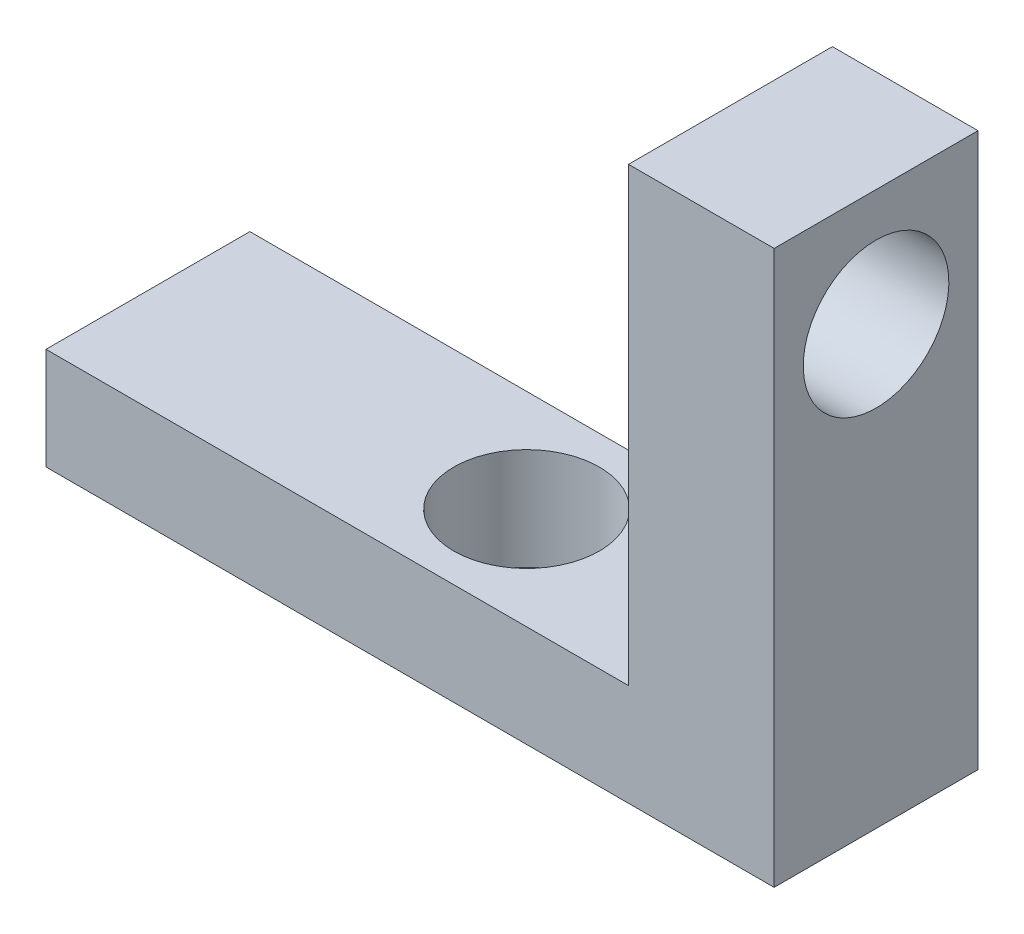
ISO-10303-21;
HEADER;
FILE_DESCRIPTION(('STEP AP214'),'2;1');
FILE_NAME('part.step','',(''),(''),'','','');
FILE_SCHEMA(('AUTOMOTIVE_DESIGN { 1 0 10303 214 1 1 1 1 }'));
ENDSEC;
DATA;
#1=APPLICATION_CONTEXT('core data for automotive mechanical design processes');
#2=APPLICATION_PROTOCOL_DEFINITION('international standard','automotive_design',2000,#1);
#3=PRODUCT_CONTEXT('',#1,'mechanical');
#4=PRODUCT('Part','Part','',(#3));
#5=PRODUCT_RELATED_PRODUCT_CATEGORY('part','',(#4));
#6=PRODUCT_DEFINITION_FORMATION('','',#4);
#7=PRODUCT_DEFINITION_CONTEXT('part definition',#1,'design');
#8=PRODUCT_DEFINITION('design','',#6,#7);
#9=PRODUCT_DEFINITION_SHAPE('','',#8);
#10=(LENGTH_UNIT() NAMED_UNIT(*) SI_UNIT(.MILLI.,.METRE.));
#11=(NAMED_UNIT(*) PLANE_ANGLE_UNIT() SI_UNIT($,.RADIAN.));
#12=(NAMED_UNIT(*) SI_UNIT($,.STERADIAN.) SOLID_ANGLE_UNIT());
#13=UNCERTAINTY_MEASURE_WITH_UNIT(LENGTH_MEASURE(1.E-05),#10,'distance_accuracy_value','');
#14=(GEOMETRIC_REPRESENTATION_CONTEXT(3) GLOBAL_UNCERTAINTY_ASSIGNED_CONTEXT((#13)) GLOBAL_UNIT_ASSIGNED_CONTEXT((#10,
#11,#12)) REPRESENTATION_CONTEXT('',''));
#15=CARTESIAN_POINT('',(0.,0.,0.));
#16=DIRECTION('',(0.,0.,1.));
#17=DIRECTION('',(1.,0.,0.));
#18=AXIS2_PLACEMENT_3D('',#15,#16,#17);
#19=CARTESIAN_POINT('',(12.5,9.5,7.));
#20=DIRECTION('',(-1.,0.,0.));
#21=DIRECTION('',(0.,-1.,0.));
#22=AXIS2_PLACEMENT_3D('',#19,#20,#21);
#23=PLANE('',#22);
#24=CARTESIAN_POINT('',(12.5,5.5,3.5));
#25=DIRECTION('',(1.,0.,0.));
#26=DIRECTION('',(0.,1.,0.));
#27=AXIS2_PLACEMENT_3D('',#24,#25,#26);
#28=CIRCLE('',#27,2.5);
#29=CARTESIAN_POINT('',(12.5,8.,3.5));
#30=VERTEX_POINT('',#29);
#31=EDGE_CURVE('E157',#30,#30,#28,.T.);
#32=ORIENTED_EDGE('',*,*,#31,.F.);
#33=EDGE_LOOP('',(#32));
#34=FACE_BOUND('',#33,.T.);
#35=DIRECTION('',(0.,1.,0.));
#36=VECTOR('',#35,1.);
#37=CARTESIAN_POINT('',(12.5,9.5,0.));
#38=LINE('',#37,#36);
#39=CARTESIAN_POINT('',(12.5,-9.5,0.));
#40=VERTEX_POINT('',#39);
#41=CARTESIAN_POINT('',(12.5,9.5,0.));
#42=VERTEX_POINT('',#41);
#43=EDGE_CURVE('E123',#40,#42,#38,.T.);
#44=ORIENTED_EDGE('',*,*,#43,.T.);
#45=DIRECTION('',(0.,0.,-1.));
#46=VECTOR('',#45,1.);
#47=CARTESIAN_POINT('',(12.5,9.5,7.));
#48=LINE('',#47,#46);
#49=CARTESIAN_POINT('',(12.5,9.5,7.));
#50=VERTEX_POINT('',#49);
#51=EDGE_CURVE('E11',#50,#42,#48,.T.);
#52=ORIENTED_EDGE('',*,*,#51,.F.);
#53=DIRECTION('',(0.,1.,0.));
#54=VECTOR('',#53,1.);
#55=CARTESIAN_POINT('',(12.5,9.5,7.));
#56=LINE('',#55,#54);
#57=CARTESIAN_POINT('',(12.5,-9.5,7.));
#58=VERTEX_POINT('',#57);
#59=EDGE_CURVE('E120',#58,#50,#56,.T.);
#60=ORIENTED_EDGE('',*,*,#59,.F.);
#61=DIRECTION('',(0.,0.,-1.));
#62=VECTOR('',#61,1.);
#63=CARTESIAN_POINT('',(12.5,-9.5,7.));
#64=LINE('',#63,#62);
#65=EDGE_CURVE('E127',#58,#40,#64,.T.);
#66=ORIENTED_EDGE('',*,*,#65,.T.);
#67=EDGE_LOOP('',(#44,#52,#60,#66));
#68=FACE_BOUND('',#67,.T.);
#69=ADVANCED_FACE('F36',(#34,#68),#23,.F.);
#70=CARTESIAN_POINT('',(-12.5,9.5,7.));
#71=DIRECTION('',(0.,-1.,0.));
#72=DIRECTION('',(0.,0.,-1.));
#73=AXIS2_PLACEMENT_3D('',#70,#71,#72);
#74=PLANE('',#73);
#75=DIRECTION('',(-1.,0.,0.));
#76=VECTOR('',#75,1.);
#77=CARTESIAN_POINT('',(-12.5,9.5,0.));
#78=LINE('',#77,#76);
#79=CARTESIAN_POINT('',(7.5,9.5,0.));
#80=VERTEX_POINT('',#79);
#81=EDGE_CURVE('E118',#42,#80,#78,.T.);
#82=ORIENTED_EDGE('',*,*,#81,.T.);
#83=DIRECTION('',(0.,0.,1.));
#84=VECTOR('',#83,1.);
#85=CARTESIAN_POINT('',(7.5,9.5,0.));
#86=LINE('',#85,#84);
#87=CARTESIAN_POINT('',(7.5,9.5,7.));
#88=VERTEX_POINT('',#87);
#89=EDGE_CURVE('E135',#80,#88,#86,.T.);
#90=ORIENTED_EDGE('',*,*,#89,.T.);
#91=DIRECTION('',(-1.,0.,0.));
#92=VECTOR('',#91,1.);
#93=CARTESIAN_POINT('',(-12.5,9.5,7.));
#94=LINE('',#93,#92);
#95=EDGE_CURVE('E83',#50,#88,#94,.T.);
#96=ORIENTED_EDGE('',*,*,#95,.F.);
#97=ORIENTED_EDGE('',*,*,#51,.T.);
#98=EDGE_LOOP('',(#82,#90,#96,#97));
#99=FACE_BOUND('',#98,.T.);
#100=ADVANCED_FACE('F145',(#99),#74,.F.);
#101=CARTESIAN_POINT('',(-12.5,9.5,7.));
#102=DIRECTION('',(1.,0.,0.));
#103=DIRECTION('',(0.,1.,0.));
#104=AXIS2_PLACEMENT_3D('',#101,#102,#103);
#105=PLANE('',#104);
#106=DIRECTION('',(0.,-1.,0.));
#107=VECTOR('',#106,1.);
#108=CARTESIAN_POINT('',(-12.5,9.5,7.));
#109=LINE('',#108,#107);
#110=CARTESIAN_POINT('',(-12.5,-6.,7.));
#111=VERTEX_POINT('',#110);
#112=CARTESIAN_POINT('',(-12.5,-9.5,7.));
#113=VERTEX_POINT('',#112);
#114=EDGE_CURVE('E114',#111,#113,#109,.T.);
#115=ORIENTED_EDGE('',*,*,#114,.F.);
#116=DIRECTION('',(0.,0.,1.));
#117=VECTOR('',#116,1.);
#118=CARTESIAN_POINT('',(-12.5,-6.,0.));
#119=LINE('',#118,#117);
#120=CARTESIAN_POINT('',(-12.5,-6.,0.));
#121=VERTEX_POINT('',#120);
#122=EDGE_CURVE('E102',#121,#111,#119,.T.);
#123=ORIENTED_EDGE('',*,*,#122,.F.);
#124=DIRECTION('',(0.,-1.,0.));
#125=VECTOR('',#124,1.);
#126=CARTESIAN_POINT('',(-12.5,9.5,0.));
#127=LINE('',#126,#125);
#128=CARTESIAN_POINT('',(-12.5,-9.5,0.));
#129=VERTEX_POINT('',#128);
#130=EDGE_CURVE('E113',#121,#129,#127,.T.);
#131=ORIENTED_EDGE('',*,*,#130,.T.);
#132=DIRECTION('',(0.,0.,-1.));
#133=VECTOR('',#132,1.);
#134=CARTESIAN_POINT('',(-12.5,-9.5,7.));
#135=LINE('',#134,#133);
#136=EDGE_CURVE('E44',#113,#129,#135,.T.);
#137=ORIENTED_EDGE('',*,*,#136,.F.);
#138=EDGE_LOOP('',(#115,#123,#131,#137));
#139=FACE_BOUND('',#138,.T.);
#140=ADVANCED_FACE('F111',(#139),#105,.F.);
#141=CARTESIAN_POINT('',(-12.5,-9.5,7.));
#142=DIRECTION('',(0.,1.,0.));
#143=DIRECTION('',(0.,0.,1.));
#144=AXIS2_PLACEMENT_3D('',#141,#142,#143);
#145=PLANE('',#144);
#146=CARTESIAN_POINT('',(0.499999999999997,-9.5,3.5));
#147=DIRECTION('',(0.,1.,0.));
#148=DIRECTION('',(0.,0.,1.));
#149=AXIS2_PLACEMENT_3D('',#146,#147,#148);
#150=CIRCLE('',#149,2.5);
#151=CARTESIAN_POINT('',(0.499999999999997,-9.5,6.));
#152=VERTEX_POINT('',#151);
#153=EDGE_CURVE('E149',#152,#152,#150,.T.);
#154=ORIENTED_EDGE('',*,*,#153,.T.);
#155=EDGE_LOOP('',(#154));
#156=FACE_BOUND('',#155,.T.);
#157=DIRECTION('',(1.,0.,0.));
#158=VECTOR('',#157,1.);
#159=CARTESIAN_POINT('',(-12.5,-9.5,0.));
#160=LINE('',#159,#158);
#161=EDGE_CURVE('E77',#129,#40,#160,.T.);
#162=ORIENTED_EDGE('',*,*,#161,.T.);
#163=ORIENTED_EDGE('',*,*,#65,.F.);
#164=DIRECTION('',(1.,0.,0.));
#165=VECTOR('',#164,1.);
#166=CARTESIAN_POINT('',(-12.5,-9.5,7.));
#167=LINE('',#166,#165);
#168=EDGE_CURVE('E60',#113,#58,#167,.T.);
#169=ORIENTED_EDGE('',*,*,#168,.F.);
#170=ORIENTED_EDGE('',*,*,#136,.T.);
#171=EDGE_LOOP('',(#162,#163,#169,#170));
#172=FACE_BOUND('',#171,.T.);
#173=ADVANCED_FACE('F129',(#156,#172),#145,.F.);
#174=CARTESIAN_POINT('',(0.,0.,7.));
#175=DIRECTION('',(0.,0.,1.));
#176=DIRECTION('',(1.,0.,0.));
#177=AXIS2_PLACEMENT_3D('',#174,#175,#176);
#178=PLANE('',#177);
#179=DIRECTION('',(0.,1.,0.));
#180=VECTOR('',#179,1.);
#181=CARTESIAN_POINT('',(7.5,9.5,7.));
#182=LINE('',#181,#180);
#183=CARTESIAN_POINT('',(7.5,-6.,7.));
#184=VERTEX_POINT('',#183);
#185=EDGE_CURVE('E107',#184,#88,#182,.T.);
#186=ORIENTED_EDGE('',*,*,#185,.F.);
#187=DIRECTION('',(1.,0.,0.));
#188=VECTOR('',#187,1.);
#189=CARTESIAN_POINT('',(-12.5,-6.,7.));
#190=LINE('',#189,#188);
#191=EDGE_CURVE('E148',#111,#184,#190,.T.);
#192=ORIENTED_EDGE('',*,*,#191,.F.);
#193=ORIENTED_EDGE('',*,*,#114,.T.);
#194=ORIENTED_EDGE('',*,*,#168,.T.);
#195=ORIENTED_EDGE('',*,*,#59,.T.);
#196=ORIENTED_EDGE('',*,*,#95,.T.);
#197=EDGE_LOOP('',(#186,#192,#193,#194,#195,#196));
#198=FACE_BOUND('',#197,.T.);
#199=ADVANCED_FACE('F144',(#198),#178,.T.);
#200=CARTESIAN_POINT('',(0.,0.,0.));
#201=DIRECTION('',(0.,0.,1.));
#202=DIRECTION('',(1.,0.,0.));
#203=AXIS2_PLACEMENT_3D('',#200,#201,#202);
#204=PLANE('',#203);
#205=DIRECTION('',(1.,0.,0.));
#206=VECTOR('',#205,1.);
#207=CARTESIAN_POINT('',(-12.5,-6.,0.));
#208=LINE('',#207,#206);
#209=CARTESIAN_POINT('',(7.5,-6.,0.));
#210=VERTEX_POINT('',#209);
#211=EDGE_CURVE('E98',#121,#210,#208,.T.);
#212=ORIENTED_EDGE('',*,*,#211,.T.);
#213=DIRECTION('',(0.,1.,0.));
#214=VECTOR('',#213,1.);
#215=CARTESIAN_POINT('',(7.5,9.5,0.));
#216=LINE('',#215,#214);
#217=EDGE_CURVE('E51',#210,#80,#216,.T.);
#218=ORIENTED_EDGE('',*,*,#217,.T.);
#219=ORIENTED_EDGE('',*,*,#81,.F.);
#220=ORIENTED_EDGE('',*,*,#43,.F.);
#221=ORIENTED_EDGE('',*,*,#161,.F.);
#222=ORIENTED_EDGE('',*,*,#130,.F.);
#223=EDGE_LOOP('',(#212,#218,#219,#220,#221,#222));
#224=FACE_BOUND('',#223,.T.);
#225=ADVANCED_FACE('F116',(#224),#204,.F.);
#226=CARTESIAN_POINT('',(7.5,9.5,0.));
#227=DIRECTION('',(1.,0.,0.));
#228=DIRECTION('',(0.,1.,0.));
#229=AXIS2_PLACEMENT_3D('',#226,#227,#228);
#230=PLANE('',#229);
#231=CARTESIAN_POINT('',(7.5,5.5,3.5));
#232=DIRECTION('',(1.,0.,0.));
#233=DIRECTION('',(0.,1.,0.));
#234=AXIS2_PLACEMENT_3D('',#231,#232,#233);
#235=CIRCLE('',#234,2.5);
#236=CARTESIAN_POINT('',(7.5,8.,3.5));
#237=VERTEX_POINT('',#236);
#238=EDGE_CURVE('E39',#237,#237,#235,.T.);
#239=ORIENTED_EDGE('',*,*,#238,.T.);
#240=EDGE_LOOP('',(#239));
#241=FACE_BOUND('',#240,.T.);
#242=ORIENTED_EDGE('',*,*,#185,.T.);
#243=ORIENTED_EDGE('',*,*,#89,.F.);
#244=ORIENTED_EDGE('',*,*,#217,.F.);
#245=DIRECTION('',(0.,0.,1.));
#246=VECTOR('',#245,1.);
#247=CARTESIAN_POINT('',(7.5,-6.,0.));
#248=LINE('',#247,#246);
#249=EDGE_CURVE('E104',#210,#184,#248,.T.);
#250=ORIENTED_EDGE('',*,*,#249,.T.);
#251=EDGE_LOOP('',(#242,#243,#244,#250));
#252=FACE_BOUND('',#251,.T.);
#253=ADVANCED_FACE('F164',(#241,#252),#230,.F.);
#254=CARTESIAN_POINT('',(-12.5,-6.,0.));
#255=DIRECTION('',(0.,-1.,0.));
#256=DIRECTION('',(0.,0.,-1.));
#257=AXIS2_PLACEMENT_3D('',#254,#255,#256);
#258=PLANE('',#257);
#259=CARTESIAN_POINT('',(0.499999999999997,-6.,3.5));
#260=DIRECTION('',(0.,1.,0.));
#261=DIRECTION('',(0.,0.,1.));
#262=AXIS2_PLACEMENT_3D('',#259,#260,#261);
#263=CIRCLE('',#262,2.5);
#264=CARTESIAN_POINT('',(0.499999999999997,-6.,6.));
#265=VERTEX_POINT('',#264);
#266=EDGE_CURVE('E151',#265,#265,#263,.T.);
#267=ORIENTED_EDGE('',*,*,#266,.F.);
#268=EDGE_LOOP('',(#267));
#269=FACE_BOUND('',#268,.T.);
#270=ORIENTED_EDGE('',*,*,#191,.T.);
#271=ORIENTED_EDGE('',*,*,#249,.F.);
#272=ORIENTED_EDGE('',*,*,#211,.F.);
#273=ORIENTED_EDGE('',*,*,#122,.T.);
#274=EDGE_LOOP('',(#270,#271,#272,#273));
#275=FACE_BOUND('',#274,.T.);
#276=ADVANCED_FACE('F101',(#269,#275),#258,.F.);
#277=CARTESIAN_POINT('',(0.499999999999997,-9.5,3.5));
#278=DIRECTION('',(0.,1.,0.));
#279=DIRECTION('',(0.,0.,1.));
#280=AXIS2_PLACEMENT_3D('',#277,#278,#279);
#281=CYLINDRICAL_SURFACE('',#280,2.5);
#282=CARTESIAN_POINT('',(0.499999999999997,-9.5,6.));
#283=CARTESIAN_POINT('',(0.499999999999997,-9.46354166666667,6.));
#284=CARTESIAN_POINT('',(0.499999999999997,-9.42708333333333,6.));
#285=CARTESIAN_POINT('',(0.499999999999997,-9.35416666666667,6.));
#286=CARTESIAN_POINT('',(0.499999999999997,-9.31770833333333,6.));
#287=CARTESIAN_POINT('',(0.499999999999997,-9.24479166666667,6.));
#288=CARTESIAN_POINT('',(0.499999999999997,-9.20833333333333,6.));
#289=CARTESIAN_POINT('',(0.499999999999997,-9.13541666666667,6.));
#290=CARTESIAN_POINT('',(0.499999999999997,-9.09895833333333,6.));
#291=CARTESIAN_POINT('',(0.499999999999997,-9.02604166666667,6.));
#292=CARTESIAN_POINT('',(0.499999999999997,-8.98958333333333,6.));
#293=CARTESIAN_POINT('',(0.499999999999997,-8.91666666666667,6.));
#294=CARTESIAN_POINT('',(0.499999999999997,-8.88020833333333,6.));
#295=CARTESIAN_POINT('',(0.499999999999997,-8.80729166666667,6.));
#296=CARTESIAN_POINT('',(0.499999999999997,-8.77083333333333,6.));
#297=CARTESIAN_POINT('',(0.499999999999997,-8.69791666666667,6.));
#298=CARTESIAN_POINT('',(0.499999999999997,-8.66145833333333,6.));
#299=CARTESIAN_POINT('',(0.499999999999997,-8.58854166666667,6.));
#300=CARTESIAN_POINT('',(0.499999999999997,-8.55208333333333,6.));
#301=CARTESIAN_POINT('',(0.499999999999997,-8.47916666666667,6.));
#302=CARTESIAN_POINT('',(0.499999999999997,-8.44270833333333,6.));
#303=CARTESIAN_POINT('',(0.499999999999997,-8.36979166666667,6.));
#304=CARTESIAN_POINT('',(0.499999999999997,-8.33333333333333,6.));
#305=CARTESIAN_POINT('',(0.499999999999997,-8.26041666666667,6.));
#306=CARTESIAN_POINT('',(0.499999999999997,-8.22395833333333,6.));
#307=CARTESIAN_POINT('',(0.499999999999997,-8.15104166666667,6.));
#308=CARTESIAN_POINT('',(0.499999999999997,-8.11458333333333,6.));
#309=CARTESIAN_POINT('',(0.499999999999997,-8.04166666666667,6.));
#310=CARTESIAN_POINT('',(0.499999999999997,-8.00520833333333,6.));
#311=CARTESIAN_POINT('',(0.499999999999997,-7.93229166666667,6.));
#312=CARTESIAN_POINT('',(0.499999999999997,-7.89583333333333,6.));
#313=CARTESIAN_POINT('',(0.499999999999997,-7.82291666666667,6.));
#314=CARTESIAN_POINT('',(0.499999999999997,-7.78645833333333,6.));
#315=CARTESIAN_POINT('',(0.499999999999997,-7.71354166666667,6.));
#316=CARTESIAN_POINT('',(0.499999999999997,-7.67708333333333,6.));
#317=CARTESIAN_POINT('',(0.499999999999997,-7.60416666666667,6.));
#318=CARTESIAN_POINT('',(0.499999999999997,-7.56770833333333,6.));
#319=CARTESIAN_POINT('',(0.499999999999997,-7.49479166666667,6.));
#320=CARTESIAN_POINT('',(0.499999999999997,-7.45833333333333,6.));
#321=CARTESIAN_POINT('',(0.499999999999997,-7.38541666666667,6.));
#322=CARTESIAN_POINT('',(0.499999999999997,-7.34895833333333,6.));
#323=CARTESIAN_POINT('',(0.499999999999997,-7.27604166666667,6.));
#324=CARTESIAN_POINT('',(0.499999999999997,-7.23958333333333,6.));
#325=CARTESIAN_POINT('',(0.499999999999997,-7.16666666666667,6.));
#326=CARTESIAN_POINT('',(0.499999999999997,-7.13020833333333,6.));
#327=CARTESIAN_POINT('',(0.499999999999997,-7.05729166666667,6.));
#328=CARTESIAN_POINT('',(0.499999999999997,-7.02083333333333,6.));
#329=CARTESIAN_POINT('',(0.499999999999997,-6.94791666666667,6.));
#330=CARTESIAN_POINT('',(0.499999999999997,-6.91145833333333,6.));
#331=CARTESIAN_POINT('',(0.499999999999997,-6.83854166666667,6.));
#332=CARTESIAN_POINT('',(0.499999999999997,-6.80208333333333,6.));
#333=CARTESIAN_POINT('',(0.499999999999997,-6.72916666666667,6.));
#334=CARTESIAN_POINT('',(0.499999999999997,-6.69270833333333,6.));
#335=CARTESIAN_POINT('',(0.499999999999997,-6.61979166666667,6.));
#336=CARTESIAN_POINT('',(0.499999999999997,-6.58333333333333,6.));
#337=CARTESIAN_POINT('',(0.499999999999997,-6.51041666666667,6.));
#338=CARTESIAN_POINT('',(0.499999999999997,-6.47395833333333,6.));
#339=CARTESIAN_POINT('',(0.499999999999997,-6.40104166666667,6.));
#340=CARTESIAN_POINT('',(0.499999999999997,-6.36458333333333,6.));
#341=CARTESIAN_POINT('',(0.499999999999997,-6.29166666666667,6.));
#342=CARTESIAN_POINT('',(0.499999999999997,-6.25520833333333,6.));
#343=CARTESIAN_POINT('',(0.499999999999997,-6.18229166666667,6.));
#344=CARTESIAN_POINT('',(0.499999999999997,-6.14583333333333,6.));
#345=CARTESIAN_POINT('',(0.499999999999997,-6.07291666666667,6.));
#346=CARTESIAN_POINT('',(0.499999999999997,-6.03645833333333,6.));
#347=CARTESIAN_POINT('',(0.499999999999997,-6.,6.));
#348=B_SPLINE_CURVE_WITH_KNOTS('',3,(#282,#283,#284,#285,#286,#287,#288,#289,#290,#291,#292,
#293,#294,#295,#296,#297,#298,#299,#300,#301,#302,#303,#304,#305,#306,#307,#308,#309,#310,#311,
#312,#313,#314,#315,#316,#317,#318,#319,#320,#321,#322,#323,#324,#325,#326,#327,#328,#329,#330,
#331,#332,#333,#334,#335,#336,#337,#338,#339,#340,#341,#342,#343,#344,#345,#346,#347),
.UNSPECIFIED.,.F.,.F.,(4,2,2,2,2,2,2,2,2,2,2,2,2,2,2,2,2,2,2,2,2,2,2,2,2,2,2,2,2,2,2,2,4),(0.,
0.109374999999998,0.218749999999998,0.328124999999999,0.437499999999999,0.546874999999999,
0.656249999999999,0.765624999999999,0.874999999999999,0.984374999999999,1.09375,1.203125,1.3125,
1.421875,1.53125,1.640625,1.75,1.859375,1.96875,2.078125,2.1875,2.296875,2.40625,2.515625,2.625,
2.734375,2.84375,2.953125,3.0625,3.171875,3.28125,3.390625,3.5),.UNSPECIFIED.);
#349=EDGE_CURVE('BSEAM168',#152,#265,#348,.T.);
#350=ORIENTED_EDGE('',*,*,#153,.F.);
#351=ORIENTED_EDGE('',*,*,#266,.T.);
#352=ORIENTED_EDGE('',*,*,#349,.T.);
#353=ORIENTED_EDGE('',*,*,#349,.F.);
#354=EDGE_LOOP('',(#350,#352,#351,#353));
#355=FACE_BOUND('',#354,.T.);
#356=ADVANCED_FACE('F168',(#355),#281,.F.);
#357=CARTESIAN_POINT('',(2.5,5.5,3.5));
#358=DIRECTION('',(1.,0.,0.));
#359=DIRECTION('',(0.,1.,0.));
#360=AXIS2_PLACEMENT_3D('',#357,#358,#359);
#361=CYLINDRICAL_SURFACE('',#360,2.5);
#362=ORIENTED_EDGE('',*,*,#31,.T.);
#363=EDGE_LOOP('',(#362));
#364=FACE_BOUND('',#363,.T.);
#365=ORIENTED_EDGE('',*,*,#238,.F.);
#366=EDGE_LOOP('',(#365));
#367=FACE_BOUND('',#366,.T.);
#368=ADVANCED_FACE('F166',(#364,#367),#361,.F.);
#369=CLOSED_SHELL('',(#69,#100,#140,#173,#199,#225,#253,#276,#356,#368));
#370=MANIFOLD_SOLID_BREP('B2',#369);
#371=ADVANCED_BREP_SHAPE_REPRESENTATION('',(#18,#370),#14);
#372=SHAPE_DEFINITION_REPRESENTATION(#9,#371);
ENDSEC;
END-ISO-10303-21;
